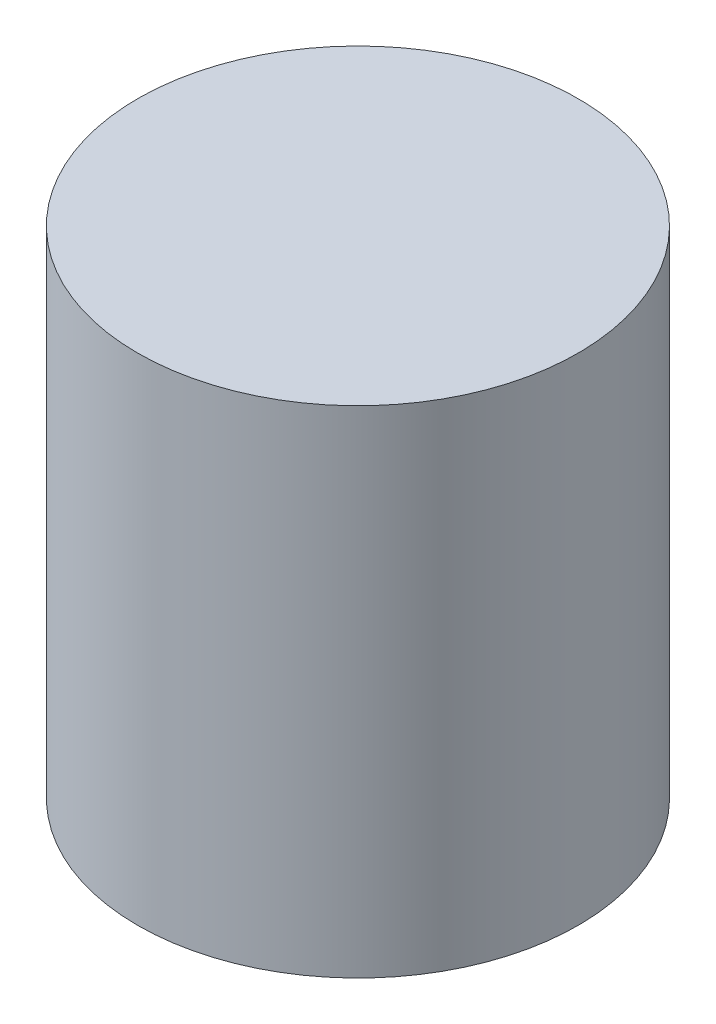
ISO-10303-21;
HEADER;
FILE_DESCRIPTION(('STEP AP214'),'2;1');
FILE_NAME('part.step','',(''),(''),'','','');
FILE_SCHEMA(('AUTOMOTIVE_DESIGN { 1 0 10303 214 1 1 1 1 }'));
ENDSEC;
DATA;
#1=APPLICATION_CONTEXT('core data for automotive mechanical design processes');
#2=APPLICATION_PROTOCOL_DEFINITION('international standard','automotive_design',2000,#1);
#3=PRODUCT_CONTEXT('',#1,'mechanical');
#4=PRODUCT('Part','Part','',(#3));
#5=PRODUCT_RELATED_PRODUCT_CATEGORY('part','',(#4));
#6=PRODUCT_DEFINITION_FORMATION('','',#4);
#7=PRODUCT_DEFINITION_CONTEXT('part definition',#1,'design');
#8=PRODUCT_DEFINITION('design','',#6,#7);
#9=PRODUCT_DEFINITION_SHAPE('','',#8);
#10=(LENGTH_UNIT() NAMED_UNIT(*) SI_UNIT(.MILLI.,.METRE.));
#11=(NAMED_UNIT(*) PLANE_ANGLE_UNIT() SI_UNIT($,.RADIAN.));
#12=(NAMED_UNIT(*) SI_UNIT($,.STERADIAN.) SOLID_ANGLE_UNIT());
#13=UNCERTAINTY_MEASURE_WITH_UNIT(LENGTH_MEASURE(1.E-05),#10,'distance_accuracy_value','');
#14=(GEOMETRIC_REPRESENTATION_CONTEXT(3) GLOBAL_UNCERTAINTY_ASSIGNED_CONTEXT((#13)) GLOBAL_UNIT_ASSIGNED_CONTEXT((#10,
#11,#12)) REPRESENTATION_CONTEXT('',''));
#15=CARTESIAN_POINT('',(0.,0.,0.));
#16=DIRECTION('',(0.,0.,1.));
#17=DIRECTION('',(1.,0.,0.));
#18=AXIS2_PLACEMENT_3D('',#15,#16,#17);
#19=CARTESIAN_POINT('',(0.,48.65,0.));
#20=DIRECTION('',(0.,-1.,0.));
#21=DIRECTION('',(0.,0.,-1.));
#22=AXIS2_PLACEMENT_3D('',#19,#20,#21);
#23=CYLINDRICAL_SURFACE('',#22,21.625);
#24=CARTESIAN_POINT('',(0.,48.65,0.));
#25=DIRECTION('',(0.,1.,0.));
#26=DIRECTION('',(0.,0.,1.));
#27=AXIS2_PLACEMENT_3D('',#24,#25,#26);
#28=CIRCLE('',#27,21.625);
#29=CARTESIAN_POINT('',(0.,48.65,21.625));
#30=VERTEX_POINT('',#29);
#31=EDGE_CURVE('E10',#30,#30,#28,.T.);
#32=ORIENTED_EDGE('',*,*,#31,.F.);
#33=EDGE_LOOP('',(#32));
#34=FACE_BOUND('',#33,.T.);
#35=CARTESIAN_POINT('',(0.,0.,0.));
#36=DIRECTION('',(0.,1.,0.));
#37=DIRECTION('',(0.,0.,1.));
#38=AXIS2_PLACEMENT_3D('',#35,#36,#37);
#39=CIRCLE('',#38,21.625);
#40=CARTESIAN_POINT('',(0.,0.,21.625));
#41=VERTEX_POINT('',#40);
#42=EDGE_CURVE('E35',#41,#41,#39,.T.);
#43=ORIENTED_EDGE('',*,*,#42,.T.);
#44=EDGE_LOOP('',(#43));
#45=FACE_BOUND('',#44,.T.);
#46=ADVANCED_FACE('F32',(#34,#45),#23,.T.);
#47=CARTESIAN_POINT('',(0.,48.65,0.));
#48=DIRECTION('',(0.,1.,0.));
#49=DIRECTION('',(0.,0.,1.));
#50=AXIS2_PLACEMENT_3D('',#47,#48,#49);
#51=PLANE('',#50);
#52=ORIENTED_EDGE('',*,*,#31,.T.);
#53=EDGE_LOOP('',(#52));
#54=FACE_BOUND('',#53,.T.);
#55=ADVANCED_FACE('F61',(#54),#51,.T.);
#56=CARTESIAN_POINT('',(0.,0.,0.));
#57=DIRECTION('',(0.,1.,0.));
#58=DIRECTION('',(0.,0.,1.));
#59=AXIS2_PLACEMENT_3D('',#56,#57,#58);
#60=PLANE('',#59);
#61=CARTESIAN_POINT('',(0.,0.,0.));
#62=DIRECTION('',(0.,-1.,0.));
#63=DIRECTION('',(0.,0.,-1.));
#64=AXIS2_PLACEMENT_3D('',#61,#62,#63);
#65=CIRCLE('',#64,19.625);
#66=CARTESIAN_POINT('',(0.,0.,-19.625));
#67=VERTEX_POINT('',#66);
#68=EDGE_CURVE('E44',#67,#67,#65,.T.);
#69=ORIENTED_EDGE('',*,*,#68,.F.);
#70=EDGE_LOOP('',(#69));
#71=FACE_BOUND('',#70,.T.);
#72=ORIENTED_EDGE('',*,*,#42,.F.);
#73=EDGE_LOOP('',(#72));
#74=FACE_BOUND('',#73,.T.);
#75=ADVANCED_FACE('F55',(#71,#74),#60,.F.);
#76=CARTESIAN_POINT('',(0.,46.65,0.));
#77=DIRECTION('',(0.,-1.,0.));
#78=DIRECTION('',(0.,0.,-1.));
#79=AXIS2_PLACEMENT_3D('',#76,#77,#78);
#80=CYLINDRICAL_SURFACE('',#79,19.625);
#81=CARTESIAN_POINT('',(0.,46.65,0.));
#82=DIRECTION('',(0.,-1.,0.));
#83=DIRECTION('',(0.,0.,-1.));
#84=AXIS2_PLACEMENT_3D('',#81,#82,#83);
#85=CIRCLE('',#84,19.625);
#86=CARTESIAN_POINT('',(0.,46.65,-19.625));
#87=VERTEX_POINT('',#86);
#88=EDGE_CURVE('E42',#87,#87,#85,.T.);
#89=ORIENTED_EDGE('',*,*,#88,.F.);
#90=EDGE_LOOP('',(#89));
#91=FACE_BOUND('',#90,.T.);
#92=ORIENTED_EDGE('',*,*,#68,.T.);
#93=EDGE_LOOP('',(#92));
#94=FACE_BOUND('',#93,.T.);
#95=ADVANCED_FACE('F52',(#91,#94),#80,.F.);
#96=CARTESIAN_POINT('',(0.,46.65,0.));
#97=DIRECTION('',(0.,-1.,0.));
#98=DIRECTION('',(0.,0.,-1.));
#99=AXIS2_PLACEMENT_3D('',#96,#97,#98);
#100=PLANE('',#99);
#101=ORIENTED_EDGE('',*,*,#88,.T.);
#102=EDGE_LOOP('',(#101));
#103=FACE_BOUND('',#102,.T.);
#104=ADVANCED_FACE('F50',(#103),#100,.T.);
#105=CLOSED_SHELL('',(#46,#55,#75,#95,#104));
#106=MANIFOLD_SOLID_BREP('B2',#105);
#107=ADVANCED_BREP_SHAPE_REPRESENTATION('',(#18,#106),#14);
#108=SHAPE_DEFINITION_REPRESENTATION(#9,#107);
ENDSEC;
END-ISO-10303-21;
